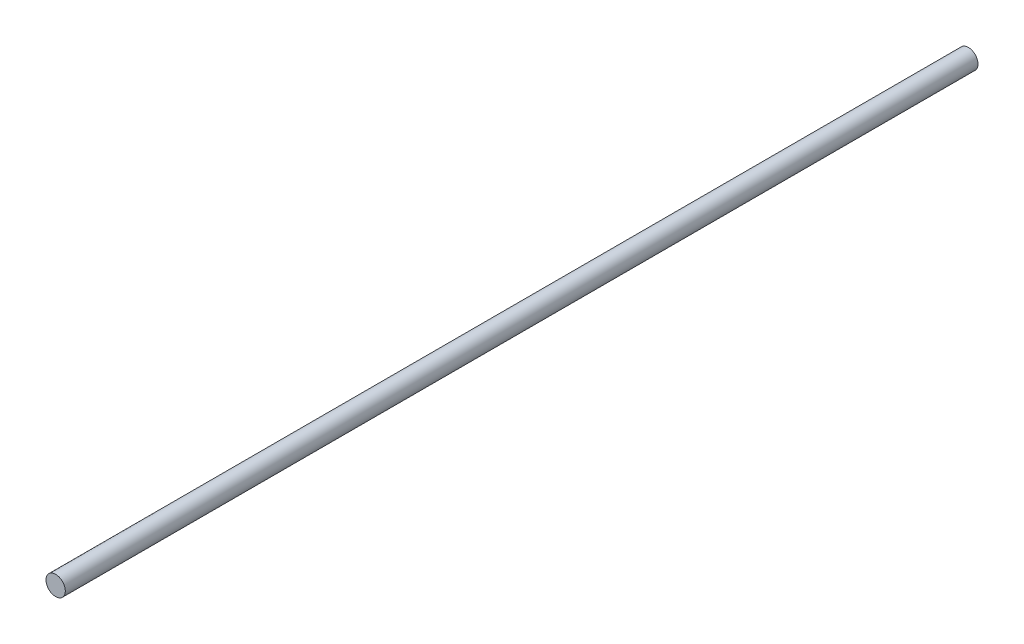
ISO-10303-21;
HEADER;
FILE_DESCRIPTION(('STEP AP214'),'2;1');
FILE_NAME('part.step','',(''),(''),'','','');
FILE_SCHEMA(('AUTOMOTIVE_DESIGN { 1 0 10303 214 1 1 1 1 }'));
ENDSEC;
DATA;
#1=APPLICATION_CONTEXT('core data for automotive mechanical design processes');
#2=APPLICATION_PROTOCOL_DEFINITION('international standard','automotive_design',2000,#1);
#3=PRODUCT_CONTEXT('',#1,'mechanical');
#4=PRODUCT('Part','Part','',(#3));
#5=PRODUCT_RELATED_PRODUCT_CATEGORY('part','',(#4));
#6=PRODUCT_DEFINITION_FORMATION('','',#4);
#7=PRODUCT_DEFINITION_CONTEXT('part definition',#1,'design');
#8=PRODUCT_DEFINITION('design','',#6,#7);
#9=PRODUCT_DEFINITION_SHAPE('','',#8);
#10=(LENGTH_UNIT() NAMED_UNIT(*) SI_UNIT(.MILLI.,.METRE.));
#11=(NAMED_UNIT(*) PLANE_ANGLE_UNIT() SI_UNIT($,.RADIAN.));
#12=(NAMED_UNIT(*) SI_UNIT($,.STERADIAN.) SOLID_ANGLE_UNIT());
#13=UNCERTAINTY_MEASURE_WITH_UNIT(LENGTH_MEASURE(1.E-05),#10,'distance_accuracy_value','');
#14=(GEOMETRIC_REPRESENTATION_CONTEXT(3) GLOBAL_UNCERTAINTY_ASSIGNED_CONTEXT((#13)) GLOBAL_UNIT_ASSIGNED_CONTEXT((#10,
#11,#12)) REPRESENTATION_CONTEXT('',''));
#15=CARTESIAN_POINT('',(0.,0.,0.));
#16=DIRECTION('',(0.,0.,1.));
#17=DIRECTION('',(1.,0.,0.));
#18=AXIS2_PLACEMENT_3D('',#15,#16,#17);
#19=CARTESIAN_POINT('',(0.,0.,300.));
#20=DIRECTION('',(0.,0.,-1.));
#21=DIRECTION('',(-1.,0.,0.));
#22=AXIS2_PLACEMENT_3D('',#19,#20,#21);
#23=CYLINDRICAL_SURFACE('',#22,6.35);
#24=CARTESIAN_POINT('',(0.,0.,300.));
#25=DIRECTION('',(0.,0.,1.));
#26=DIRECTION('',(1.,0.,0.));
#27=AXIS2_PLACEMENT_3D('',#24,#25,#26);
#28=CIRCLE('',#27,6.35);
#29=CARTESIAN_POINT('',(6.35,0.,300.));
#30=VERTEX_POINT('',#29);
#31=EDGE_CURVE('E10',#30,#30,#28,.T.);
#32=ORIENTED_EDGE('',*,*,#31,.F.);
#33=EDGE_LOOP('',(#32));
#34=FACE_BOUND('',#33,.T.);
#35=CARTESIAN_POINT('',(0.,0.,-300.));
#36=DIRECTION('',(0.,0.,1.));
#37=DIRECTION('',(1.,0.,0.));
#38=AXIS2_PLACEMENT_3D('',#35,#36,#37);
#39=CIRCLE('',#38,6.35);
#40=CARTESIAN_POINT('',(6.35,0.,-300.));
#41=VERTEX_POINT('',#40);
#42=EDGE_CURVE('E33',#41,#41,#39,.T.);
#43=ORIENTED_EDGE('',*,*,#42,.T.);
#44=EDGE_LOOP('',(#43));
#45=FACE_BOUND('',#44,.T.);
#46=ADVANCED_FACE('F30',(#34,#45),#23,.T.);
#47=CARTESIAN_POINT('',(0.,0.,300.));
#48=DIRECTION('',(0.,0.,1.));
#49=DIRECTION('',(1.,0.,0.));
#50=AXIS2_PLACEMENT_3D('',#47,#48,#49);
#51=PLANE('',#50);
#52=ORIENTED_EDGE('',*,*,#31,.T.);
#53=EDGE_LOOP('',(#52));
#54=FACE_BOUND('',#53,.T.);
#55=ADVANCED_FACE('F45',(#54),#51,.T.);
#56=CARTESIAN_POINT('',(0.,0.,-300.));
#57=DIRECTION('',(0.,0.,1.));
#58=DIRECTION('',(1.,0.,0.));
#59=AXIS2_PLACEMENT_3D('',#56,#57,#58);
#60=PLANE('',#59);
#61=ORIENTED_EDGE('',*,*,#42,.F.);
#62=EDGE_LOOP('',(#61));
#63=FACE_BOUND('',#62,.T.);
#64=ADVANCED_FACE('F43',(#63),#60,.F.);
#65=CLOSED_SHELL('',(#46,#55,#64));
#66=MANIFOLD_SOLID_BREP('B2',#65);
#67=ADVANCED_BREP_SHAPE_REPRESENTATION('',(#18,#66),#14);
#68=SHAPE_DEFINITION_REPRESENTATION(#9,#67);
ENDSEC;
END-ISO-10303-21;
